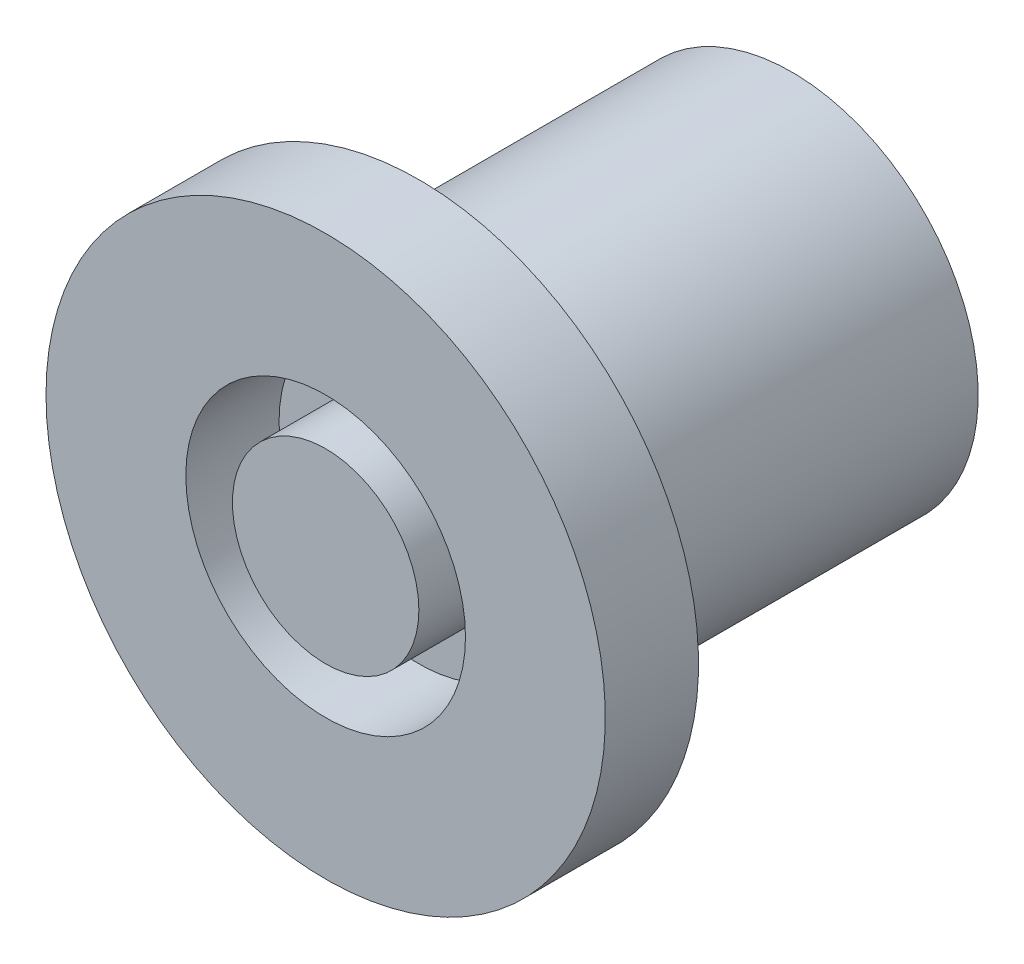
ISO-10303-21;
HEADER;
FILE_DESCRIPTION(('STEP AP214'),'2;1');
FILE_NAME('part.step','',(''),(''),'','','');
FILE_SCHEMA(('AUTOMOTIVE_DESIGN { 1 0 10303 214 1 1 1 1 }'));
ENDSEC;
DATA;
#1=APPLICATION_CONTEXT('core data for automotive mechanical design processes');
#2=APPLICATION_PROTOCOL_DEFINITION('international standard','automotive_design',2000,#1);
#3=PRODUCT_CONTEXT('',#1,'mechanical');
#4=PRODUCT('Part','Part','',(#3));
#5=PRODUCT_RELATED_PRODUCT_CATEGORY('part','',(#4));
#6=PRODUCT_DEFINITION_FORMATION('','',#4);
#7=PRODUCT_DEFINITION_CONTEXT('part definition',#1,'design');
#8=PRODUCT_DEFINITION('design','',#6,#7);
#9=PRODUCT_DEFINITION_SHAPE('','',#8);
#10=(LENGTH_UNIT() NAMED_UNIT(*) SI_UNIT(.MILLI.,.METRE.));
#11=(NAMED_UNIT(*) PLANE_ANGLE_UNIT() SI_UNIT($,.RADIAN.));
#12=(NAMED_UNIT(*) SI_UNIT($,.STERADIAN.) SOLID_ANGLE_UNIT());
#13=UNCERTAINTY_MEASURE_WITH_UNIT(LENGTH_MEASURE(1.E-05),#10,'distance_accuracy_value','');
#14=(GEOMETRIC_REPRESENTATION_CONTEXT(3) GLOBAL_UNCERTAINTY_ASSIGNED_CONTEXT((#13)) GLOBAL_UNIT_ASSIGNED_CONTEXT((#10,
#11,#12)) REPRESENTATION_CONTEXT('',''));
#15=CARTESIAN_POINT('',(0.,0.,0.));
#16=DIRECTION('',(0.,0.,1.));
#17=DIRECTION('',(1.,0.,0.));
#18=AXIS2_PLACEMENT_3D('',#15,#16,#17);
#19=CARTESIAN_POINT('',(0.,0.,2.));
#20=DIRECTION('',(0.,0.,-1.));
#21=DIRECTION('',(-1.,0.,0.));
#22=AXIS2_PLACEMENT_3D('',#19,#20,#21);
#23=CYLINDRICAL_SURFACE('',#22,1.);
#24=CARTESIAN_POINT('',(0.,0.,2.));
#25=DIRECTION('',(0.,0.,1.));
#26=DIRECTION('',(1.,0.,0.));
#27=AXIS2_PLACEMENT_3D('',#24,#25,#26);
#28=CIRCLE('',#27,1.);
#29=CARTESIAN_POINT('',(-1.,0.,2.));
#30=VERTEX_POINT('',#29);
#31=EDGE_CURVE('E10',#30,#30,#28,.T.);
#32=CARTESIAN_POINT('',(0.,0.,0.));
#33=DIRECTION('',(0.,0.,1.));
#34=DIRECTION('',(1.,0.,0.));
#35=AXIS2_PLACEMENT_3D('',#32,#33,#34);
#36=CIRCLE('',#35,1.);
#37=CARTESIAN_POINT('',(-1.,0.,0.));
#38=VERTEX_POINT('',#37);
#39=EDGE_CURVE('E40',#38,#38,#36,.T.);
#40=CARTESIAN_POINT('',(-1.,0.,2.));
#41=CARTESIAN_POINT('',(-1.,0.,1.97916666666667));
#42=CARTESIAN_POINT('',(-1.,0.,1.95833333333333));
#43=CARTESIAN_POINT('',(-1.,0.,1.91666666666667));
#44=CARTESIAN_POINT('',(-1.,0.,1.89583333333333));
#45=CARTESIAN_POINT('',(-1.,0.,1.85416666666667));
#46=CARTESIAN_POINT('',(-1.,0.,1.83333333333333));
#47=CARTESIAN_POINT('',(-1.,0.,1.79166666666667));
#48=CARTESIAN_POINT('',(-1.,0.,1.77083333333333));
#49=CARTESIAN_POINT('',(-1.,0.,1.72916666666667));
#50=CARTESIAN_POINT('',(-1.,0.,1.70833333333333));
#51=CARTESIAN_POINT('',(-1.,0.,1.66666666666667));
#52=CARTESIAN_POINT('',(-1.,0.,1.64583333333333));
#53=CARTESIAN_POINT('',(-1.,0.,1.60416666666667));
#54=CARTESIAN_POINT('',(-1.,0.,1.58333333333333));
#55=CARTESIAN_POINT('',(-1.,0.,1.54166666666667));
#56=CARTESIAN_POINT('',(-1.,0.,1.52083333333333));
#57=CARTESIAN_POINT('',(-1.,0.,1.47916666666667));
#58=CARTESIAN_POINT('',(-1.,0.,1.45833333333333));
#59=CARTESIAN_POINT('',(-1.,0.,1.41666666666667));
#60=CARTESIAN_POINT('',(-1.,0.,1.39583333333333));
#61=CARTESIAN_POINT('',(-1.,0.,1.35416666666667));
#62=CARTESIAN_POINT('',(-1.,0.,1.33333333333333));
#63=CARTESIAN_POINT('',(-1.,0.,1.29166666666667));
#64=CARTESIAN_POINT('',(-1.,0.,1.27083333333333));
#65=CARTESIAN_POINT('',(-1.,0.,1.22916666666667));
#66=CARTESIAN_POINT('',(-1.,0.,1.20833333333333));
#67=CARTESIAN_POINT('',(-1.,0.,1.16666666666667));
#68=CARTESIAN_POINT('',(-1.,0.,1.14583333333333));
#69=CARTESIAN_POINT('',(-1.,0.,1.10416666666667));
#70=CARTESIAN_POINT('',(-1.,0.,1.08333333333333));
#71=CARTESIAN_POINT('',(-1.,0.,1.04166666666667));
#72=CARTESIAN_POINT('',(-1.,0.,1.02083333333333));
#73=CARTESIAN_POINT('',(-1.,0.,0.979166666666666));
#74=CARTESIAN_POINT('',(-1.,0.,0.958333333333332));
#75=CARTESIAN_POINT('',(-1.,0.,0.916666666666666));
#76=CARTESIAN_POINT('',(-1.,0.,0.895833333333333));
#77=CARTESIAN_POINT('',(-1.,0.,0.854166666666666));
#78=CARTESIAN_POINT('',(-1.,0.,0.833333333333332));
#79=CARTESIAN_POINT('',(-1.,0.,0.791666666666666));
#80=CARTESIAN_POINT('',(-1.,0.,0.770833333333333));
#81=CARTESIAN_POINT('',(-1.,0.,0.729166666666666));
#82=CARTESIAN_POINT('',(-1.,0.,0.708333333333333));
#83=CARTESIAN_POINT('',(-1.,0.,0.666666666666666));
#84=CARTESIAN_POINT('',(-1.,0.,0.645833333333333));
#85=CARTESIAN_POINT('',(-1.,0.,0.604166666666666));
#86=CARTESIAN_POINT('',(-1.,0.,0.583333333333333));
#87=CARTESIAN_POINT('',(-1.,0.,0.541666666666666));
#88=CARTESIAN_POINT('',(-1.,0.,0.520833333333333));
#89=CARTESIAN_POINT('',(-1.,0.,0.479166666666666));
#90=CARTESIAN_POINT('',(-1.,0.,0.458333333333333));
#91=CARTESIAN_POINT('',(-1.,0.,0.416666666666666));
#92=CARTESIAN_POINT('',(-1.,0.,0.395833333333333));
#93=CARTESIAN_POINT('',(-1.,0.,0.354166666666666));
#94=CARTESIAN_POINT('',(-1.,0.,0.333333333333333));
#95=CARTESIAN_POINT('',(-1.,0.,0.291666666666666));
#96=CARTESIAN_POINT('',(-1.,0.,0.270833333333333));
#97=CARTESIAN_POINT('',(-1.,0.,0.229166666666666));
#98=CARTESIAN_POINT('',(-1.,0.,0.208333333333333));
#99=CARTESIAN_POINT('',(-1.,0.,0.166666666666666));
#100=CARTESIAN_POINT('',(-1.,0.,0.145833333333333));
#101=CARTESIAN_POINT('',(-1.,0.,0.104166666666666));
#102=CARTESIAN_POINT('',(-1.,0.,0.0833333333333331));
#103=CARTESIAN_POINT('',(-1.,0.,0.0416666666666666));
#104=CARTESIAN_POINT('',(-1.,0.,0.0208333333333333));
#105=CARTESIAN_POINT('',(-1.,0.,0.));
#106=B_SPLINE_CURVE_WITH_KNOTS('',3,(#40,#41,#42,#43,#44,#45,#46,#47,#48,#49,#50,#51,#52,#53,
#54,#55,#56,#57,#58,#59,#60,#61,#62,#63,#64,#65,#66,#67,#68,#69,#70,#71,#72,#73,#74,#75,#76,#77,
#78,#79,#80,#81,#82,#83,#84,#85,#86,#87,#88,#89,#90,#91,#92,#93,#94,#95,#96,#97,#98,#99,#100,
#101,#102,#103,#104,#105),.UNSPECIFIED.,.F.,.F.,(4,2,2,2,2,2,2,2,2,2,2,2,2,2,2,2,2,2,2,2,2,2,2,
2,2,2,2,2,2,2,2,2,4),(0.,0.0625000000000003,0.125,0.1875,0.25,0.3125,0.375,0.4375,0.5,0.5625,
0.625,0.6875,0.75,0.8125,0.874999999999999,0.9375,1.,1.0625,1.125,1.1875,1.25,1.3125,1.375,
1.4375,1.5,1.5625,1.625,1.6875,1.75,1.8125,1.875,1.9375,2.),.UNSPECIFIED.);
#107=EDGE_CURVE('BSEAM37',#30,#38,#106,.T.);
#108=ORIENTED_EDGE('',*,*,#31,.F.);
#109=ORIENTED_EDGE('',*,*,#39,.T.);
#110=ORIENTED_EDGE('',*,*,#107,.T.);
#111=ORIENTED_EDGE('',*,*,#107,.F.);
#112=EDGE_LOOP('',(#108,#110,#109,#111));
#113=FACE_BOUND('',#112,.T.);
#114=ADVANCED_FACE('F37',(#113),#23,.T.);
#115=CARTESIAN_POINT('',(0.,0.,0.));
#116=DIRECTION('',(0.,0.,1.));
#117=DIRECTION('',(1.,0.,0.));
#118=AXIS2_PLACEMENT_3D('',#115,#116,#117);
#119=PLANE('',#118);
#120=ORIENTED_EDGE('',*,*,#39,.F.);
#121=EDGE_LOOP('',(#120));
#122=FACE_BOUND('',#121,.T.);
#123=ADVANCED_FACE('F101',(#122),#119,.F.);
#124=CARTESIAN_POINT('',(0.,0.,2.5));
#125=DIRECTION('',(0.,0.,-1.));
#126=DIRECTION('',(-1.,0.,0.));
#127=AXIS2_PLACEMENT_3D('',#124,#125,#126);
#128=CYLINDRICAL_SURFACE('',#127,1.5);
#129=CARTESIAN_POINT('',(0.,0.,2.5));
#130=DIRECTION('',(0.,0.,1.));
#131=DIRECTION('',(1.,0.,0.));
#132=AXIS2_PLACEMENT_3D('',#129,#130,#131);
#133=CIRCLE('',#132,1.5);
#134=CARTESIAN_POINT('',(-1.5,0.,2.5));
#135=VERTEX_POINT('',#134);
#136=EDGE_CURVE('E49',#135,#135,#133,.T.);
#137=CARTESIAN_POINT('',(0.,0.,2.));
#138=DIRECTION('',(0.,0.,1.));
#139=DIRECTION('',(1.,0.,0.));
#140=AXIS2_PLACEMENT_3D('',#137,#138,#139);
#141=CIRCLE('',#140,1.5);
#142=CARTESIAN_POINT('',(-1.5,0.,2.));
#143=VERTEX_POINT('',#142);
#144=EDGE_CURVE('E51',#143,#143,#141,.T.);
#145=CARTESIAN_POINT('',(-1.5,0.,2.5));
#146=CARTESIAN_POINT('',(-1.5,0.,2.49479166666667));
#147=CARTESIAN_POINT('',(-1.5,0.,2.48958333333333));
#148=CARTESIAN_POINT('',(-1.5,0.,2.47916666666667));
#149=CARTESIAN_POINT('',(-1.5,0.,2.47395833333333));
#150=CARTESIAN_POINT('',(-1.5,0.,2.46354166666667));
#151=CARTESIAN_POINT('',(-1.5,0.,2.45833333333333));
#152=CARTESIAN_POINT('',(-1.5,0.,2.44791666666667));
#153=CARTESIAN_POINT('',(-1.5,0.,2.44270833333333));
#154=CARTESIAN_POINT('',(-1.5,0.,2.43229166666667));
#155=CARTESIAN_POINT('',(-1.5,0.,2.42708333333333));
#156=CARTESIAN_POINT('',(-1.5,0.,2.41666666666667));
#157=CARTESIAN_POINT('',(-1.5,0.,2.41145833333333));
#158=CARTESIAN_POINT('',(-1.5,0.,2.40104166666667));
#159=CARTESIAN_POINT('',(-1.5,0.,2.39583333333333));
#160=CARTESIAN_POINT('',(-1.5,0.,2.38541666666667));
#161=CARTESIAN_POINT('',(-1.5,0.,2.38020833333333));
#162=CARTESIAN_POINT('',(-1.5,0.,2.36979166666667));
#163=CARTESIAN_POINT('',(-1.5,0.,2.36458333333333));
#164=CARTESIAN_POINT('',(-1.5,0.,2.35416666666667));
#165=CARTESIAN_POINT('',(-1.5,0.,2.34895833333333));
#166=CARTESIAN_POINT('',(-1.5,0.,2.33854166666667));
#167=CARTESIAN_POINT('',(-1.5,0.,2.33333333333333));
#168=CARTESIAN_POINT('',(-1.5,0.,2.32291666666667));
#169=CARTESIAN_POINT('',(-1.5,0.,2.31770833333333));
#170=CARTESIAN_POINT('',(-1.5,0.,2.30729166666667));
#171=CARTESIAN_POINT('',(-1.5,0.,2.30208333333333));
#172=CARTESIAN_POINT('',(-1.5,0.,2.29166666666667));
#173=CARTESIAN_POINT('',(-1.5,0.,2.28645833333333));
#174=CARTESIAN_POINT('',(-1.5,0.,2.27604166666667));
#175=CARTESIAN_POINT('',(-1.5,0.,2.27083333333333));
#176=CARTESIAN_POINT('',(-1.5,0.,2.26041666666667));
#177=CARTESIAN_POINT('',(-1.5,0.,2.25520833333333));
#178=CARTESIAN_POINT('',(-1.5,0.,2.24479166666667));
#179=CARTESIAN_POINT('',(-1.5,0.,2.23958333333333));
#180=CARTESIAN_POINT('',(-1.5,0.,2.22916666666667));
#181=CARTESIAN_POINT('',(-1.5,0.,2.22395833333333));
#182=CARTESIAN_POINT('',(-1.5,0.,2.21354166666667));
#183=CARTESIAN_POINT('',(-1.5,0.,2.20833333333333));
#184=CARTESIAN_POINT('',(-1.5,0.,2.19791666666667));
#185=CARTESIAN_POINT('',(-1.5,0.,2.19270833333333));
#186=CARTESIAN_POINT('',(-1.5,0.,2.18229166666667));
#187=CARTESIAN_POINT('',(-1.5,0.,2.17708333333333));
#188=CARTESIAN_POINT('',(-1.5,0.,2.16666666666667));
#189=CARTESIAN_POINT('',(-1.5,0.,2.16145833333333));
#190=CARTESIAN_POINT('',(-1.5,0.,2.15104166666667));
#191=CARTESIAN_POINT('',(-1.5,0.,2.14583333333333));
#192=CARTESIAN_POINT('',(-1.5,0.,2.13541666666667));
#193=CARTESIAN_POINT('',(-1.5,0.,2.13020833333333));
#194=CARTESIAN_POINT('',(-1.5,0.,2.11979166666667));
#195=CARTESIAN_POINT('',(-1.5,0.,2.11458333333333));
#196=CARTESIAN_POINT('',(-1.5,0.,2.10416666666667));
#197=CARTESIAN_POINT('',(-1.5,0.,2.09895833333333));
#198=CARTESIAN_POINT('',(-1.5,0.,2.08854166666667));
#199=CARTESIAN_POINT('',(-1.5,0.,2.08333333333333));
#200=CARTESIAN_POINT('',(-1.5,0.,2.07291666666667));
#201=CARTESIAN_POINT('',(-1.5,0.,2.06770833333333));
#202=CARTESIAN_POINT('',(-1.5,0.,2.05729166666667));
#203=CARTESIAN_POINT('',(-1.5,0.,2.05208333333333));
#204=CARTESIAN_POINT('',(-1.5,0.,2.04166666666667));
#205=CARTESIAN_POINT('',(-1.5,0.,2.03645833333333));
#206=CARTESIAN_POINT('',(-1.5,0.,2.02604166666667));
#207=CARTESIAN_POINT('',(-1.5,0.,2.02083333333333));
#208=CARTESIAN_POINT('',(-1.5,0.,2.01041666666667));
#209=CARTESIAN_POINT('',(-1.5,0.,2.00520833333333));
#210=CARTESIAN_POINT('',(-1.5,0.,2.));
#211=B_SPLINE_CURVE_WITH_KNOTS('',3,(#145,#146,#147,#148,#149,#150,#151,#152,#153,#154,#155,
#156,#157,#158,#159,#160,#161,#162,#163,#164,#165,#166,#167,#168,#169,#170,#171,#172,#173,#174,
#175,#176,#177,#178,#179,#180,#181,#182,#183,#184,#185,#186,#187,#188,#189,#190,#191,#192,#193,
#194,#195,#196,#197,#198,#199,#200,#201,#202,#203,#204,#205,#206,#207,#208,#209,#210),
.UNSPECIFIED.,.F.,.F.,(4,2,2,2,2,2,2,2,2,2,2,2,2,2,2,2,2,2,2,2,2,2,2,2,2,2,2,2,2,2,2,2,4),(0.,
0.015625,0.03125,0.046875,0.0625000000000001,0.0781249999999996,0.0937500000000001,0.109375,
0.125,0.140625,0.15625,0.171875,0.1875,0.203125,0.21875,0.234375,0.25,0.265625,0.28125,0.296875,
0.3125,0.328125,0.34375,0.359375,0.375,0.390625,0.40625,0.421875,0.4375,0.453125,0.46875,
0.484375,0.5),.UNSPECIFIED.);
#212=EDGE_CURVE('BSEAM94',#135,#143,#211,.T.);
#213=ORIENTED_EDGE('',*,*,#136,.F.);
#214=ORIENTED_EDGE('',*,*,#144,.T.);
#215=ORIENTED_EDGE('',*,*,#212,.T.);
#216=ORIENTED_EDGE('',*,*,#212,.F.);
#217=EDGE_LOOP('',(#213,#215,#214,#216));
#218=FACE_BOUND('',#217,.T.);
#219=ADVANCED_FACE('F94',(#218),#128,.T.);
#220=CARTESIAN_POINT('',(0.,0.,2.5));
#221=DIRECTION('',(0.,0.,1.));
#222=DIRECTION('',(1.,0.,0.));
#223=AXIS2_PLACEMENT_3D('',#220,#221,#222);
#224=PLANE('',#223);
#225=CARTESIAN_POINT('',(0.,0.,2.5));
#226=DIRECTION('',(0.,0.,1.));
#227=DIRECTION('',(1.,0.,0.));
#228=AXIS2_PLACEMENT_3D('',#225,#226,#227);
#229=CIRCLE('',#228,0.75);
#230=CARTESIAN_POINT('',(0.75,0.,2.5));
#231=VERTEX_POINT('',#230);
#232=EDGE_CURVE('E59',#231,#231,#229,.T.);
#233=ORIENTED_EDGE('',*,*,#232,.F.);
#234=EDGE_LOOP('',(#233));
#235=FACE_BOUND('',#234,.T.);
#236=ORIENTED_EDGE('',*,*,#136,.T.);
#237=EDGE_LOOP('',(#236));
#238=FACE_BOUND('',#237,.T.);
#239=ADVANCED_FACE('F91',(#235,#238),#224,.T.);
#240=CARTESIAN_POINT('',(0.,0.,2.));
#241=DIRECTION('',(0.,0.,1.));
#242=DIRECTION('',(1.,0.,0.));
#243=AXIS2_PLACEMENT_3D('',#240,#241,#242);
#244=PLANE('',#243);
#245=ORIENTED_EDGE('',*,*,#31,.T.);
#246=EDGE_LOOP('',(#245));
#247=FACE_BOUND('',#246,.T.);
#248=ORIENTED_EDGE('',*,*,#144,.F.);
#249=EDGE_LOOP('',(#248));
#250=FACE_BOUND('',#249,.T.);
#251=ADVANCED_FACE('F87',(#247,#250),#244,.F.);
#252=CARTESIAN_POINT('',(0.,0.,2.));
#253=DIRECTION('',(0.,0.,1.));
#254=DIRECTION('',(1.,0.,0.));
#255=AXIS2_PLACEMENT_3D('',#252,#253,#254);
#256=CYLINDRICAL_SURFACE('',#255,0.75);
#257=CARTESIAN_POINT('',(0.,0.,2.));
#258=DIRECTION('',(0.,0.,1.));
#259=DIRECTION('',(1.,0.,0.));
#260=AXIS2_PLACEMENT_3D('',#257,#258,#259);
#261=CIRCLE('',#260,0.75);
#262=CARTESIAN_POINT('',(0.75,0.,2.));
#263=VERTEX_POINT('',#262);
#264=EDGE_CURVE('E55',#263,#263,#261,.T.);
#265=CARTESIAN_POINT('',(0.75,0.,2.));
#266=CARTESIAN_POINT('',(0.75,0.,2.00520833333333));
#267=CARTESIAN_POINT('',(0.75,0.,2.01041666666666));
#268=CARTESIAN_POINT('',(0.75,0.,2.02083333333333));
#269=CARTESIAN_POINT('',(0.75,0.,2.02604166666667));
#270=CARTESIAN_POINT('',(0.75,0.,2.03645833333333));
#271=CARTESIAN_POINT('',(0.75,0.,2.04166666666667));
#272=CARTESIAN_POINT('',(0.75,0.,2.05208333333333));
#273=CARTESIAN_POINT('',(0.75,0.,2.05729166666667));
#274=CARTESIAN_POINT('',(0.75,0.,2.06770833333333));
#275=CARTESIAN_POINT('',(0.75,0.,2.07291666666666));
#276=CARTESIAN_POINT('',(0.75,0.,2.08333333333333));
#277=CARTESIAN_POINT('',(0.75,0.,2.08854166666666));
#278=CARTESIAN_POINT('',(0.75,0.,2.09895833333333));
#279=CARTESIAN_POINT('',(0.75,0.,2.10416666666667));
#280=CARTESIAN_POINT('',(0.75,0.,2.11458333333333));
#281=CARTESIAN_POINT('',(0.75,0.,2.11979166666667));
#282=CARTESIAN_POINT('',(0.75,0.,2.13020833333333));
#283=CARTESIAN_POINT('',(0.75,0.,2.13541666666667));
#284=CARTESIAN_POINT('',(0.75,0.,2.14583333333333));
#285=CARTESIAN_POINT('',(0.75,0.,2.15104166666666));
#286=CARTESIAN_POINT('',(0.75,0.,2.16145833333333));
#287=CARTESIAN_POINT('',(0.75,0.,2.16666666666666));
#288=CARTESIAN_POINT('',(0.75,0.,2.17708333333333));
#289=CARTESIAN_POINT('',(0.75,0.,2.18229166666667));
#290=CARTESIAN_POINT('',(0.75,0.,2.19270833333333));
#291=CARTESIAN_POINT('',(0.75,0.,2.19791666666667));
#292=CARTESIAN_POINT('',(0.75,0.,2.20833333333333));
#293=CARTESIAN_POINT('',(0.75,0.,2.21354166666667));
#294=CARTESIAN_POINT('',(0.75,0.,2.22395833333333));
#295=CARTESIAN_POINT('',(0.75,0.,2.22916666666667));
#296=CARTESIAN_POINT('',(0.75,0.,2.23958333333333));
#297=CARTESIAN_POINT('',(0.75,0.,2.24479166666667));
#298=CARTESIAN_POINT('',(0.75,0.,2.25520833333333));
#299=CARTESIAN_POINT('',(0.75,0.,2.26041666666667));
#300=CARTESIAN_POINT('',(0.75,0.,2.27083333333333));
#301=CARTESIAN_POINT('',(0.75,0.,2.27604166666667));
#302=CARTESIAN_POINT('',(0.75,0.,2.28645833333333));
#303=CARTESIAN_POINT('',(0.75,0.,2.29166666666667));
#304=CARTESIAN_POINT('',(0.75,0.,2.30208333333333));
#305=CARTESIAN_POINT('',(0.75,0.,2.30729166666666));
#306=CARTESIAN_POINT('',(0.75,0.,2.31770833333333));
#307=CARTESIAN_POINT('',(0.75,0.,2.32291666666667));
#308=CARTESIAN_POINT('',(0.75,0.,2.33333333333333));
#309=CARTESIAN_POINT('',(0.75,0.,2.33854166666667));
#310=CARTESIAN_POINT('',(0.75,0.,2.34895833333333));
#311=CARTESIAN_POINT('',(0.75,0.,2.35416666666667));
#312=CARTESIAN_POINT('',(0.75,0.,2.36458333333333));
#313=CARTESIAN_POINT('',(0.75,0.,2.36979166666667));
#314=CARTESIAN_POINT('',(0.75,0.,2.38020833333333));
#315=CARTESIAN_POINT('',(0.75,0.,2.38541666666667));
#316=CARTESIAN_POINT('',(0.75,0.,2.39583333333333));
#317=CARTESIAN_POINT('',(0.75,0.,2.40104166666667));
#318=CARTESIAN_POINT('',(0.75,0.,2.41145833333333));
#319=CARTESIAN_POINT('',(0.75,0.,2.41666666666667));
#320=CARTESIAN_POINT('',(0.75,0.,2.42708333333333));
#321=CARTESIAN_POINT('',(0.75,0.,2.43229166666667));
#322=CARTESIAN_POINT('',(0.75,0.,2.44270833333333));
#323=CARTESIAN_POINT('',(0.75,0.,2.44791666666667));
#324=CARTESIAN_POINT('',(0.75,0.,2.45833333333333));
#325=CARTESIAN_POINT('',(0.75,0.,2.46354166666667));
#326=CARTESIAN_POINT('',(0.75,0.,2.47395833333333));
#327=CARTESIAN_POINT('',(0.75,0.,2.47916666666667));
#328=CARTESIAN_POINT('',(0.75,0.,2.48958333333333));
#329=CARTESIAN_POINT('',(0.75,0.,2.49479166666667));
#330=CARTESIAN_POINT('',(0.75,0.,2.5));
#331=B_SPLINE_CURVE_WITH_KNOTS('',3,(#265,#266,#267,#268,#269,#270,#271,#272,#273,#274,#275,
#276,#277,#278,#279,#280,#281,#282,#283,#284,#285,#286,#287,#288,#289,#290,#291,#292,#293,#294,
#295,#296,#297,#298,#299,#300,#301,#302,#303,#304,#305,#306,#307,#308,#309,#310,#311,#312,#313,
#314,#315,#316,#317,#318,#319,#320,#321,#322,#323,#324,#325,#326,#327,#328,#329,#330),
.UNSPECIFIED.,.F.,.F.,(4,2,2,2,2,2,2,2,2,2,2,2,2,2,2,2,2,2,2,2,2,2,2,2,2,2,2,2,2,2,2,2,4),(0.,
0.0156250000000004,0.0312500000000005,0.0468750000000005,0.0625000000000005,0.0781250000000001,
0.0937500000000005,0.109375000000001,0.125000000000001,0.140625000000001,0.15625,
0.171875000000001,0.187500000000001,0.203125000000001,0.218750000000001,0.234375000000001,
0.250000000000001,0.265625000000001,0.281250000000001,0.296875000000001,0.3125,
0.328125000000001,0.343750000000001,0.359375000000001,0.375000000000001,0.390625000000001,
0.406250000000001,0.421875000000001,0.437500000000001,0.453125000000001,0.468750000000001,
0.484375000000001,0.500000000000001),.UNSPECIFIED.);
#332=EDGE_CURVE('BSEAM81',#263,#231,#331,.T.);
#333=ORIENTED_EDGE('',*,*,#264,.F.);
#334=ORIENTED_EDGE('',*,*,#232,.T.);
#335=ORIENTED_EDGE('',*,*,#332,.T.);
#336=ORIENTED_EDGE('',*,*,#332,.F.);
#337=EDGE_LOOP('',(#333,#335,#334,#336));
#338=FACE_BOUND('',#337,.T.);
#339=ADVANCED_FACE('F81',(#338),#256,.F.);
#340=CARTESIAN_POINT('',(0.,0.,2.));
#341=DIRECTION('',(0.,0.,1.));
#342=DIRECTION('',(1.,0.,0.));
#343=AXIS2_PLACEMENT_3D('',#340,#341,#342);
#344=PLANE('',#343);
#345=CARTESIAN_POINT('',(0.,0.,2.));
#346=DIRECTION('',(0.,0.,1.));
#347=DIRECTION('',(1.,0.,0.));
#348=AXIS2_PLACEMENT_3D('',#345,#346,#347);
#349=CIRCLE('',#348,0.5);
#350=CARTESIAN_POINT('',(0.5,0.,2.));
#351=VERTEX_POINT('',#350);
#352=EDGE_CURVE('E63',#351,#351,#349,.T.);
#353=ORIENTED_EDGE('',*,*,#352,.F.);
#354=EDGE_LOOP('',(#353));
#355=FACE_BOUND('',#354,.T.);
#356=ORIENTED_EDGE('',*,*,#264,.T.);
#357=EDGE_LOOP('',(#356));
#358=FACE_BOUND('',#357,.T.);
#359=ADVANCED_FACE('F78',(#355,#358),#344,.T.);
#360=CARTESIAN_POINT('',(0.,0.,2.));
#361=DIRECTION('',(0.,0.,1.));
#362=DIRECTION('',(1.,0.,0.));
#363=AXIS2_PLACEMENT_3D('',#360,#361,#362);
#364=CYLINDRICAL_SURFACE('',#363,0.5);
#365=CARTESIAN_POINT('',(0.,0.,2.5));
#366=DIRECTION('',(0.,0.,1.));
#367=DIRECTION('',(1.,0.,0.));
#368=AXIS2_PLACEMENT_3D('',#365,#366,#367);
#369=CIRCLE('',#368,0.5);
#370=CARTESIAN_POINT('',(0.5,0.,2.5));
#371=VERTEX_POINT('',#370);
#372=EDGE_CURVE('E67',#371,#371,#369,.T.);
#373=CARTESIAN_POINT('',(0.5,0.,2.));
#374=CARTESIAN_POINT('',(0.5,0.,2.00520833333333));
#375=CARTESIAN_POINT('',(0.5,0.,2.01041666666667));
#376=CARTESIAN_POINT('',(0.5,0.,2.02083333333333));
#377=CARTESIAN_POINT('',(0.5,0.,2.02604166666667));
#378=CARTESIAN_POINT('',(0.5,0.,2.03645833333333));
#379=CARTESIAN_POINT('',(0.5,0.,2.04166666666667));
#380=CARTESIAN_POINT('',(0.5,0.,2.05208333333333));
#381=CARTESIAN_POINT('',(0.5,0.,2.05729166666667));
#382=CARTESIAN_POINT('',(0.5,0.,2.06770833333333));
#383=CARTESIAN_POINT('',(0.5,0.,2.07291666666666));
#384=CARTESIAN_POINT('',(0.5,0.,2.08333333333333));
#385=CARTESIAN_POINT('',(0.5,0.,2.08854166666666));
#386=CARTESIAN_POINT('',(0.5,0.,2.09895833333333));
#387=CARTESIAN_POINT('',(0.5,0.,2.10416666666667));
#388=CARTESIAN_POINT('',(0.5,0.,2.11458333333333));
#389=CARTESIAN_POINT('',(0.5,0.,2.11979166666667));
#390=CARTESIAN_POINT('',(0.5,0.,2.13020833333333));
#391=CARTESIAN_POINT('',(0.5,0.,2.13541666666667));
#392=CARTESIAN_POINT('',(0.5,0.,2.14583333333333));
#393=CARTESIAN_POINT('',(0.5,0.,2.15104166666666));
#394=CARTESIAN_POINT('',(0.5,0.,2.16145833333333));
#395=CARTESIAN_POINT('',(0.5,0.,2.16666666666666));
#396=CARTESIAN_POINT('',(0.5,0.,2.17708333333333));
#397=CARTESIAN_POINT('',(0.5,0.,2.18229166666667));
#398=CARTESIAN_POINT('',(0.5,0.,2.19270833333333));
#399=CARTESIAN_POINT('',(0.5,0.,2.19791666666667));
#400=CARTESIAN_POINT('',(0.5,0.,2.20833333333333));
#401=CARTESIAN_POINT('',(0.5,0.,2.21354166666667));
#402=CARTESIAN_POINT('',(0.5,0.,2.22395833333333));
#403=CARTESIAN_POINT('',(0.5,0.,2.22916666666667));
#404=CARTESIAN_POINT('',(0.5,0.,2.23958333333333));
#405=CARTESIAN_POINT('',(0.5,0.,2.24479166666667));
#406=CARTESIAN_POINT('',(0.5,0.,2.25520833333333));
#407=CARTESIAN_POINT('',(0.5,0.,2.26041666666667));
#408=CARTESIAN_POINT('',(0.5,0.,2.27083333333333));
#409=CARTESIAN_POINT('',(0.5,0.,2.27604166666667));
#410=CARTESIAN_POINT('',(0.5,0.,2.28645833333333));
#411=CARTESIAN_POINT('',(0.5,0.,2.29166666666667));
#412=CARTESIAN_POINT('',(0.5,0.,2.30208333333333));
#413=CARTESIAN_POINT('',(0.5,0.,2.30729166666666));
#414=CARTESIAN_POINT('',(0.5,0.,2.31770833333333));
#415=CARTESIAN_POINT('',(0.5,0.,2.32291666666667));
#416=CARTESIAN_POINT('',(0.5,0.,2.33333333333333));
#417=CARTESIAN_POINT('',(0.5,0.,2.33854166666667));
#418=CARTESIAN_POINT('',(0.5,0.,2.34895833333333));
#419=CARTESIAN_POINT('',(0.5,0.,2.35416666666667));
#420=CARTESIAN_POINT('',(0.5,0.,2.36458333333333));
#421=CARTESIAN_POINT('',(0.5,0.,2.36979166666667));
#422=CARTESIAN_POINT('',(0.5,0.,2.38020833333333));
#423=CARTESIAN_POINT('',(0.5,0.,2.38541666666667));
#424=CARTESIAN_POINT('',(0.5,0.,2.39583333333333));
#425=CARTESIAN_POINT('',(0.5,0.,2.40104166666667));
#426=CARTESIAN_POINT('',(0.5,0.,2.41145833333333));
#427=CARTESIAN_POINT('',(0.5,0.,2.41666666666667));
#428=CARTESIAN_POINT('',(0.5,0.,2.42708333333333));
#429=CARTESIAN_POINT('',(0.5,0.,2.43229166666667));
#430=CARTESIAN_POINT('',(0.5,0.,2.44270833333333));
#431=CARTESIAN_POINT('',(0.5,0.,2.44791666666667));
#432=CARTESIAN_POINT('',(0.5,0.,2.45833333333333));
#433=CARTESIAN_POINT('',(0.5,0.,2.46354166666667));
#434=CARTESIAN_POINT('',(0.5,0.,2.47395833333333));
#435=CARTESIAN_POINT('',(0.5,0.,2.47916666666667));
#436=CARTESIAN_POINT('',(0.5,0.,2.48958333333333));
#437=CARTESIAN_POINT('',(0.5,0.,2.49479166666667));
#438=CARTESIAN_POINT('',(0.5,0.,2.5));
#439=B_SPLINE_CURVE_WITH_KNOTS('',3,(#373,#374,#375,#376,#377,#378,#379,#380,#381,#382,#383,
#384,#385,#386,#387,#388,#389,#390,#391,#392,#393,#394,#395,#396,#397,#398,#399,#400,#401,#402,
#403,#404,#405,#406,#407,#408,#409,#410,#411,#412,#413,#414,#415,#416,#417,#418,#419,#420,#421,
#422,#423,#424,#425,#426,#427,#428,#429,#430,#431,#432,#433,#434,#435,#436,#437,#438),
.UNSPECIFIED.,.F.,.F.,(4,2,2,2,2,2,2,2,2,2,2,2,2,2,2,2,2,2,2,2,2,2,2,2,2,2,2,2,2,2,2,2,4),(0.,
0.015625,0.03125,0.046875,0.0625000000000001,0.0781249999999996,0.0937500000000001,0.109375,
0.125,0.140625,0.15625,0.171875,0.1875,0.203125,0.21875,0.234375,0.25,0.265625,0.28125,0.296875,
0.3125,0.328125,0.34375,0.359375,0.375,0.390625,0.40625,0.421875,0.4375,0.453125,0.46875,
0.484375,0.5),.UNSPECIFIED.);
#440=EDGE_CURVE('BSEAM75',#351,#371,#439,.T.);
#441=ORIENTED_EDGE('',*,*,#352,.T.);
#442=ORIENTED_EDGE('',*,*,#372,.F.);
#443=ORIENTED_EDGE('',*,*,#440,.T.);
#444=ORIENTED_EDGE('',*,*,#440,.F.);
#445=EDGE_LOOP('',(#441,#443,#442,#444));
#446=FACE_BOUND('',#445,.T.);
#447=ADVANCED_FACE('F75',(#446),#364,.T.);
#448=ORIENTED_EDGE('',*,*,#372,.T.);
#449=EDGE_LOOP('',(#448));
#450=FACE_BOUND('',#449,.T.);
#451=ADVANCED_FACE('F96',(#450),#224,.T.);
#452=CLOSED_SHELL('',(#114,#123,#219,#239,#251,#339,#359,#447,#451));
#453=MANIFOLD_SOLID_BREP('B2',#452);
#454=ADVANCED_BREP_SHAPE_REPRESENTATION('',(#18,#453),#14);
#455=SHAPE_DEFINITION_REPRESENTATION(#9,#454);
ENDSEC;
END-ISO-10303-21;
